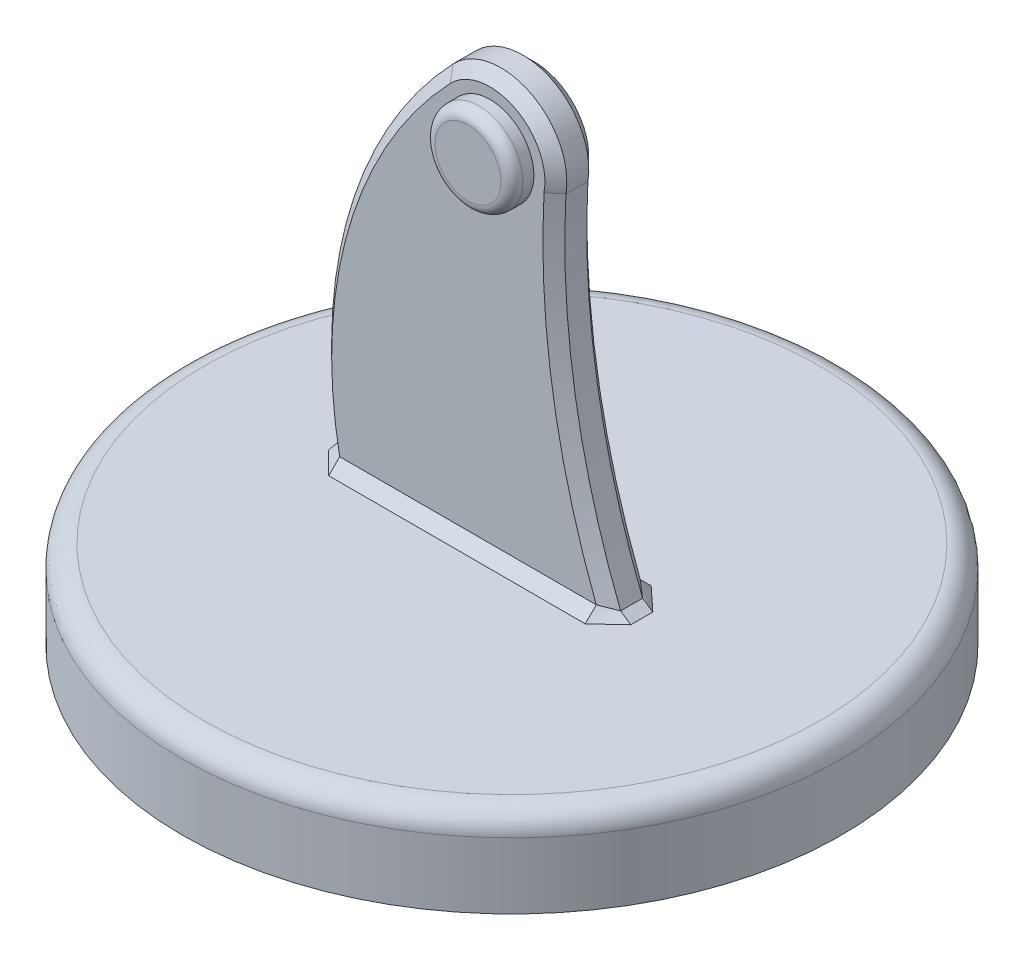
ISO-10303-21;
HEADER;
FILE_DESCRIPTION(('STEP AP214'),'2;1');
FILE_NAME('part.step','',(''),(''),'','','');
FILE_SCHEMA(('AUTOMOTIVE_DESIGN { 1 0 10303 214 1 1 1 1 }'));
ENDSEC;
DATA;
#1=APPLICATION_CONTEXT('core data for automotive mechanical design processes');
#2=APPLICATION_PROTOCOL_DEFINITION('international standard','automotive_design',2000,#1);
#3=PRODUCT_CONTEXT('',#1,'mechanical');
#4=PRODUCT('Part','Part','',(#3));
#5=PRODUCT_RELATED_PRODUCT_CATEGORY('part','',(#4));
#6=PRODUCT_DEFINITION_FORMATION('','',#4);
#7=PRODUCT_DEFINITION_CONTEXT('part definition',#1,'design');
#8=PRODUCT_DEFINITION('design','',#6,#7);
#9=PRODUCT_DEFINITION_SHAPE('','',#8);
#10=(LENGTH_UNIT() NAMED_UNIT(*) SI_UNIT(.MILLI.,.METRE.));
#11=(NAMED_UNIT(*) PLANE_ANGLE_UNIT() SI_UNIT($,.RADIAN.));
#12=(NAMED_UNIT(*) SI_UNIT($,.STERADIAN.) SOLID_ANGLE_UNIT());
#13=UNCERTAINTY_MEASURE_WITH_UNIT(LENGTH_MEASURE(1.E-05),#10,'distance_accuracy_value','');
#14=(GEOMETRIC_REPRESENTATION_CONTEXT(3) GLOBAL_UNCERTAINTY_ASSIGNED_CONTEXT((#13)) GLOBAL_UNIT_ASSIGNED_CONTEXT((#10,
#11,#12)) REPRESENTATION_CONTEXT('',''));
#15=CARTESIAN_POINT('',(0.,0.,0.));
#16=DIRECTION('',(0.,0.,1.));
#17=DIRECTION('',(1.,0.,0.));
#18=AXIS2_PLACEMENT_3D('',#15,#16,#17);
#19=CARTESIAN_POINT('',(0.,20.,0.));
#20=DIRECTION('',(0.,-1.,0.));
#21=DIRECTION('',(0.,0.,-1.));
#22=AXIS2_PLACEMENT_3D('',#19,#20,#21);
#23=CYLINDRICAL_SURFACE('',#22,75.);
#24=CARTESIAN_POINT('',(0.,15.,0.));
#25=DIRECTION('',(0.,1.,0.));
#26=DIRECTION('',(0.,0.,1.));
#27=AXIS2_PLACEMENT_3D('',#24,#25,#26);
#28=CIRCLE('',#27,75.);
#29=CARTESIAN_POINT('',(0.,15.,75.));
#30=VERTEX_POINT('',#29);
#31=EDGE_CURVE('E147',#30,#30,#28,.F.);
#32=ORIENTED_EDGE('',*,*,#31,.T.);
#33=EDGE_LOOP('',(#32));
#34=FACE_BOUND('',#33,.T.);
#35=CARTESIAN_POINT('',(0.,0.,0.));
#36=DIRECTION('',(0.,1.,0.));
#37=DIRECTION('',(0.,0.,1.));
#38=AXIS2_PLACEMENT_3D('',#35,#36,#37);
#39=CIRCLE('',#38,75.);
#40=CARTESIAN_POINT('',(0.,0.,75.));
#41=VERTEX_POINT('',#40);
#42=EDGE_CURVE('E432',#41,#41,#39,.T.);
#43=ORIENTED_EDGE('',*,*,#42,.T.);
#44=EDGE_LOOP('',(#43));
#45=FACE_BOUND('',#44,.T.);
#46=ADVANCED_FACE('F46',(#34,#45),#23,.T.);
#47=CARTESIAN_POINT('',(0.,20.,0.));
#48=DIRECTION('',(0.,1.,0.));
#49=DIRECTION('',(0.,0.,1.));
#50=AXIS2_PLACEMENT_3D('',#47,#48,#49);
#51=PLANE('',#50);
#52=DIRECTION('',(0.,0.,1.));
#53=VECTOR('',#52,1.);
#54=CARTESIAN_POINT('',(29.5605188092957,20.,0.));
#55=LINE('',#54,#53);
#56=CARTESIAN_POINT('',(29.5605188092957,20.,-2.49999999999997));
#57=VERTEX_POINT('',#56);
#58=CARTESIAN_POINT('',(29.5605188092957,20.,2.50000000000005));
#59=VERTEX_POINT('',#58);
#60=EDGE_CURVE('E487',#57,#59,#55,.T.);
#61=ORIENTED_EDGE('',*,*,#60,.T.);
#62=CARTESIAN_POINT('',(24.1925625260793,20.,7.49999999999995));
#63=CARTESIAN_POINT('',(25.0872219066154,20.,6.66666666666663));
#64=CARTESIAN_POINT('',(25.9818812871514,20.,5.83333333333332));
#65=CARTESIAN_POINT('',(27.7712000482236,20.,4.16666666666668));
#66=CARTESIAN_POINT('',(28.6658594287597,20.,3.33333333333337));
#67=CARTESIAN_POINT('',(29.5605188092957,20.,2.50000000000005));
#68=B_SPLINE_CURVE_WITH_KNOTS('',3,(#62,#63,#64,#65,#66,#67),.UNSPECIFIED.,.F.,.F.,(4,2,4),(0.,
3.66793384136498,7.33586768272996),.UNSPECIFIED.);
#69=CARTESIAN_POINT('',(24.1925625260793,20.,7.49999999999995));
#70=VERTEX_POINT('',#69);
#71=EDGE_CURVE('E228',#59,#70,#68,.F.);
#72=ORIENTED_EDGE('',*,*,#71,.T.);
#73=DIRECTION('',(-1.,0.,0.));
#74=VECTOR('',#73,1.);
#75=CARTESIAN_POINT('',(-36.2257918410724,20.,7.49999999999995));
#76=LINE('',#75,#74);
#77=CARTESIAN_POINT('',(-34.1909523693283,20.,7.49999999999995));
#78=VERTEX_POINT('',#77);
#79=EDGE_CURVE('E142',#70,#78,#76,.T.);
#80=ORIENTED_EDGE('',*,*,#79,.T.);
#81=CARTESIAN_POINT('',(-39.2818145076383,20.,2.50000000000005));
#82=CARTESIAN_POINT('',(-38.8244759997525,20.,2.94917589149019));
#83=CARTESIAN_POINT('',(-38.3671374918667,20.,3.39835178298034));
#84=CARTESIAN_POINT('',(-37.4524604760952,20.,4.29670356596062));
#85=CARTESIAN_POINT('',(-36.9951219682094,20.,4.74587945745076));
#86=CARTESIAN_POINT('',(-35.7555064299919,20.,5.96337023262725));
#87=CARTESIAN_POINT('',(-34.9732293996601,20.,6.7316851163136));
#88=CARTESIAN_POINT('',(-34.1909523693283,20.,7.49999999999995));
#89=B_SPLINE_CURVE_WITH_KNOTS('',3,(#81,#82,#83,#84,#85,#86,#87,#88),.UNSPECIFIED.,.F.,.F.,(4,2,
2,4),(0.,1.92308539348108,3.84617078696217,7.13560630299044),.UNSPECIFIED.);
#90=CARTESIAN_POINT('',(-39.2818145076383,20.,2.50000000000005));
#91=VERTEX_POINT('',#90);
#92=EDGE_CURVE('E134',#91,#78,#89,.T.);
#93=ORIENTED_EDGE('',*,*,#92,.F.);
#94=DIRECTION('',(0.,0.,-1.));
#95=VECTOR('',#94,1.);
#96=CARTESIAN_POINT('',(-39.2818145076383,20.,0.));
#97=LINE('',#96,#95);
#98=CARTESIAN_POINT('',(-39.2818145076383,20.,-2.49999999999997));
#99=VERTEX_POINT('',#98);
#100=EDGE_CURVE('E139',#91,#99,#97,.T.);
#101=ORIENTED_EDGE('',*,*,#100,.T.);
#102=CARTESIAN_POINT('',(-34.1909523693283,20.,-7.49999999999995));
#103=CARTESIAN_POINT('',(-34.648290877214,20.,-7.0508241085098));
#104=CARTESIAN_POINT('',(-35.1056293850998,20.,-6.60164821701966));
#105=CARTESIAN_POINT('',(-36.0203064008713,20.,-5.70329643403938));
#106=CARTESIAN_POINT('',(-36.4776449087571,20.,-5.25412054254923));
#107=CARTESIAN_POINT('',(-37.7172604469747,20.,-4.03662976737272));
#108=CARTESIAN_POINT('',(-38.4995374773065,20.,-3.26831488368635));
#109=CARTESIAN_POINT('',(-39.2818145076383,20.,-2.49999999999997));
#110=B_SPLINE_CURVE_WITH_KNOTS('',3,(#102,#103,#104,#105,#106,#107,#108,#109),.UNSPECIFIED.,.F.,
.F.,(4,2,2,4),(0.,1.92308539348108,3.84617078696216,7.13560630299053),.UNSPECIFIED.);
#111=CARTESIAN_POINT('',(-34.1909523693283,20.,-7.49999999999995));
#112=VERTEX_POINT('',#111);
#113=EDGE_CURVE('E166',#112,#99,#110,.T.);
#114=ORIENTED_EDGE('',*,*,#113,.F.);
#115=DIRECTION('',(1.,0.,0.));
#116=VECTOR('',#115,1.);
#117=CARTESIAN_POINT('',(0.,20.,-7.49999999999995));
#118=LINE('',#117,#116);
#119=CARTESIAN_POINT('',(24.1925625260792,20.,-7.49999999999995));
#120=VERTEX_POINT('',#119);
#121=EDGE_CURVE('E170',#112,#120,#118,.T.);
#122=ORIENTED_EDGE('',*,*,#121,.T.);
#123=CARTESIAN_POINT('',(29.5605188092957,20.,-2.49999999999997));
#124=CARTESIAN_POINT('',(28.6658594287596,20.,-3.3333333333333));
#125=CARTESIAN_POINT('',(27.7712000482235,20.,-4.16666666666663));
#126=CARTESIAN_POINT('',(25.9818812871514,20.,-5.83333333333329));
#127=CARTESIAN_POINT('',(25.0872219066153,20.,-6.66666666666662));
#128=CARTESIAN_POINT('',(24.1925625260792,20.,-7.49999999999995));
#129=B_SPLINE_CURVE_WITH_KNOTS('',3,(#123,#124,#125,#126,#127,#128),.UNSPECIFIED.,.F.,.F.,(4,2,
4),(0.,3.66793384136505,7.33586768273009),.UNSPECIFIED.);
#130=EDGE_CURVE('E220',#120,#57,#129,.F.);
#131=ORIENTED_EDGE('',*,*,#130,.T.);
#132=EDGE_LOOP('',(#61,#72,#80,#93,#101,#114,#122,#131));
#133=FACE_BOUND('',#132,.T.);
#134=CARTESIAN_POINT('',(0.,20.,0.));
#135=DIRECTION('',(0.,1.,0.));
#136=DIRECTION('',(0.,0.,1.));
#137=AXIS2_PLACEMENT_3D('',#134,#135,#136);
#138=CIRCLE('',#137,70.);
#139=CARTESIAN_POINT('',(0.,20.,70.));
#140=VERTEX_POINT('',#139);
#141=EDGE_CURVE('E430',#140,#140,#138,.T.);
#142=ORIENTED_EDGE('',*,*,#141,.T.);
#143=EDGE_LOOP('',(#142));
#144=FACE_BOUND('',#143,.T.);
#145=ADVANCED_FACE('F136',(#133,#144),#51,.T.);
#146=CARTESIAN_POINT('',(0.,0.,0.));
#147=DIRECTION('',(0.,1.,0.));
#148=DIRECTION('',(0.,0.,1.));
#149=AXIS2_PLACEMENT_3D('',#146,#147,#148);
#150=PLANE('',#149);
#151=ORIENTED_EDGE('',*,*,#42,.F.);
#152=EDGE_LOOP('',(#151));
#153=FACE_BOUND('',#152,.T.);
#154=ADVANCED_FACE('F412',(#153),#150,.F.);
#155=CARTESIAN_POINT('',(0.,15.,0.));
#156=DIRECTION('',(0.,1.,0.));
#157=DIRECTION('',(0.,0.,1.));
#158=AXIS2_PLACEMENT_3D('',#155,#156,#157);
#159=TOROIDAL_SURFACE('',#158,70.,5.);
#160=ORIENTED_EDGE('',*,*,#31,.F.);
#161=EDGE_LOOP('',(#160));
#162=FACE_BOUND('',#161,.T.);
#163=ORIENTED_EDGE('',*,*,#141,.F.);
#164=EDGE_LOOP('',(#163));
#165=FACE_BOUND('',#164,.T.);
#166=ADVANCED_FACE('F415',(#162,#165),#159,.T.);
#167=CARTESIAN_POINT('',(194.538114740849,87.9877304588052,5.));
#168=DIRECTION('',(0.,0.,-1.));
#169=DIRECTION('',(-1.,0.,0.));
#170=AXIS2_PLACEMENT_3D('',#167,#168,#169);
#171=CYLINDRICAL_SURFACE('',#170,180.);
#172=DIRECTION('',(0.,0.,-1.));
#173=VECTOR('',#172,1.);
#174=CARTESIAN_POINT('',(14.7893751360172,97.4951281297934,5.));
#175=LINE('',#174,#173);
#176=CARTESIAN_POINT('',(14.7893751360172,97.4951281297934,2.50000000000005));
#177=VERTEX_POINT('',#176);
#178=CARTESIAN_POINT('',(14.7893751360172,97.4951281297934,-2.49999999999997));
#179=VERTEX_POINT('',#178);
#180=EDGE_CURVE('E438',#177,#179,#175,.T.);
#181=ORIENTED_EDGE('',*,*,#180,.F.);
#182=CARTESIAN_POINT('',(194.538114740849,87.9877304588052,2.50000000000005));
#183=DIRECTION('',(0.,0.,1.));
#184=DIRECTION('',(1.,0.,0.));
#185=AXIS2_PLACEMENT_3D('',#182,#183,#184);
#186=CIRCLE('',#185,180.);
#187=CARTESIAN_POINT('',(27.2368906975837,21.5776375991717,2.50000000000005));
#188=VERTEX_POINT('',#187);
#189=EDGE_CURVE('E517',#177,#188,#186,.T.);
#190=ORIENTED_EDGE('',*,*,#189,.T.);
#191=DIRECTION('',(0.,0.,-1.));
#192=VECTOR('',#191,1.);
#193=CARTESIAN_POINT('',(27.2368906975837,21.5776375991717,5.));
#194=LINE('',#193,#192);
#195=CARTESIAN_POINT('',(27.2368906975837,21.5776375991717,-2.49999999999997));
#196=VERTEX_POINT('',#195);
#197=EDGE_CURVE('E514',#188,#196,#194,.T.);
#198=ORIENTED_EDGE('',*,*,#197,.T.);
#199=CARTESIAN_POINT('',(194.538114740849,87.9877304588052,-2.49999999999997));
#200=DIRECTION('',(0.,0.,1.));
#201=DIRECTION('',(1.,0.,0.));
#202=AXIS2_PLACEMENT_3D('',#199,#200,#201);
#203=CIRCLE('',#202,180.);
#204=EDGE_CURVE('E490',#196,#179,#203,.F.);
#205=ORIENTED_EDGE('',*,*,#204,.T.);
#206=EDGE_LOOP('',(#181,#190,#198,#205));
#207=FACE_BOUND('',#206,.T.);
#208=ADVANCED_FACE('F417',(#207),#171,.F.);
#209=CARTESIAN_POINT('',(0.,100.,5.));
#210=DIRECTION('',(0.,0.,-1.));
#211=DIRECTION('',(-1.,0.,0.));
#212=AXIS2_PLACEMENT_3D('',#209,#210,#211);
#213=CYLINDRICAL_SURFACE('',#212,14.9999999999999);
#214=DIRECTION('',(0.,0.,-1.));
#215=VECTOR('',#214,1.);
#216=CARTESIAN_POINT('',(-10.8492014290604,110.358321695703,5.));
#217=LINE('',#216,#215);
#218=CARTESIAN_POINT('',(-10.8492014290604,110.358321695703,2.50000000000005));
#219=VERTEX_POINT('',#218);
#220=CARTESIAN_POINT('',(-10.8492014290604,110.358321695703,-2.49999999999997));
#221=VERTEX_POINT('',#220);
#222=EDGE_CURVE('E448',#219,#221,#217,.T.);
#223=ORIENTED_EDGE('',*,*,#222,.F.);
#224=CARTESIAN_POINT('',(0.,100.,2.50000000000005));
#225=DIRECTION('',(0.,0.,1.));
#226=DIRECTION('',(1.,0.,0.));
#227=AXIS2_PLACEMENT_3D('',#224,#225,#226);
#228=CIRCLE('',#227,14.9999999999999);
#229=EDGE_CURVE('E229',#219,#177,#228,.F.);
#230=ORIENTED_EDGE('',*,*,#229,.T.);
#231=ORIENTED_EDGE('',*,*,#180,.T.);
#232=CARTESIAN_POINT('',(0.,100.,-2.49999999999997));
#233=DIRECTION('',(0.,0.,1.));
#234=DIRECTION('',(1.,0.,0.));
#235=AXIS2_PLACEMENT_3D('',#232,#233,#234);
#236=CIRCLE('',#235,14.9999999999999);
#237=EDGE_CURVE('E538',#179,#221,#236,.T.);
#238=ORIENTED_EDGE('',*,*,#237,.T.);
#239=EDGE_LOOP('',(#223,#230,#231,#238));
#240=FACE_BOUND('',#239,.T.);
#241=ADVANCED_FACE('F423',(#240),#213,.T.);
#242=CARTESIAN_POINT('',(61.4788080980091,41.3028437243492,5.));
#243=DIRECTION('',(0.,0.,-1.));
#244=DIRECTION('',(-1.,0.,0.));
#245=AXIS2_PLACEMENT_3D('',#242,#243,#244);
#246=CYLINDRICAL_SURFACE('',#245,100.);
#247=DIRECTION('',(0.,0.,-1.));
#248=VECTOR('',#247,1.);
#249=CARTESIAN_POINT('',(-36.824238346525,22.9586059444963,5.));
#250=LINE('',#249,#248);
#251=CARTESIAN_POINT('',(-36.824238346525,22.9586059444963,-2.49999999999997));
#252=VERTEX_POINT('',#251);
#253=CARTESIAN_POINT('',(-36.824238346525,22.9586059444963,2.50000000000005));
#254=VERTEX_POINT('',#253);
#255=EDGE_CURVE('E523',#252,#254,#250,.F.);
#256=ORIENTED_EDGE('',*,*,#255,.T.);
#257=CARTESIAN_POINT('',(61.4788080980091,41.3028437243492,2.50000000000005));
#258=DIRECTION('',(0.,0.,1.));
#259=DIRECTION('',(1.,0.,0.));
#260=AXIS2_PLACEMENT_3D('',#257,#258,#259);
#261=CIRCLE('',#260,100.);
#262=EDGE_CURVE('E526',#254,#219,#261,.F.);
#263=ORIENTED_EDGE('',*,*,#262,.T.);
#264=ORIENTED_EDGE('',*,*,#222,.T.);
#265=CARTESIAN_POINT('',(61.4788080980091,41.3028437243492,-2.49999999999997));
#266=DIRECTION('',(0.,0.,1.));
#267=DIRECTION('',(1.,0.,0.));
#268=AXIS2_PLACEMENT_3D('',#265,#266,#267);
#269=CIRCLE('',#268,100.);
#270=EDGE_CURVE('E520',#221,#252,#269,.T.);
#271=ORIENTED_EDGE('',*,*,#270,.T.);
#272=EDGE_LOOP('',(#256,#263,#264,#271));
#273=FACE_BOUND('',#272,.T.);
#274=ADVANCED_FACE('F570',(#273),#246,.T.);
#275=CARTESIAN_POINT('',(194.538114740849,87.9877304588052,5.));
#276=DIRECTION('',(0.,0.,1.));
#277=DIRECTION('',(1.,0.,0.));
#278=AXIS2_PLACEMENT_3D('',#275,#276,#277);
#279=PLANE('',#278);
#280=CARTESIAN_POINT('',(0.,100.,5.));
#281=DIRECTION('',(0.,0.,1.));
#282=DIRECTION('',(1.,0.,0.));
#283=AXIS2_PLACEMENT_3D('',#280,#281,#282);
#284=CIRCLE('',#283,10.);
#285=CARTESIAN_POINT('',(10.,100.,5.));
#286=VERTEX_POINT('',#285);
#287=EDGE_CURVE('E241',#286,#286,#284,.T.);
#288=ORIENTED_EDGE('',*,*,#287,.F.);
#289=EDGE_LOOP('',(#288));
#290=FACE_BOUND('',#289,.T.);
#291=CARTESIAN_POINT('',(194.538114740849,87.9877304588052,5.));
#292=DIRECTION('',(0.,0.,1.));
#293=DIRECTION('',(1.,0.,0.));
#294=AXIS2_PLACEMENT_3D('',#291,#292,#293);
#295=CIRCLE('',#294,182.5);
#296=CARTESIAN_POINT('',(24.1925625260793,22.5,5.));
#297=VERTEX_POINT('',#296);
#298=CARTESIAN_POINT('',(12.3008971882817,97.7778550084835,5.));
#299=VERTEX_POINT('',#298);
#300=EDGE_CURVE('E62',#297,#299,#295,.F.);
#301=ORIENTED_EDGE('',*,*,#300,.T.);
#302=CARTESIAN_POINT('',(0.,100.,5.));
#303=DIRECTION('',(0.,0.,1.));
#304=DIRECTION('',(1.,0.,0.));
#305=AXIS2_PLACEMENT_3D('',#302,#303,#304);
#306=CIRCLE('',#305,12.4999999999999);
#307=CARTESIAN_POINT('',(-9.04100119088374,108.631934746419,5.));
#308=VERTEX_POINT('',#307);
#309=EDGE_CURVE('E536',#299,#308,#306,.T.);
#310=ORIENTED_EDGE('',*,*,#309,.T.);
#311=CARTESIAN_POINT('',(61.4788080980091,41.3028437243492,5.));
#312=DIRECTION('',(0.,0.,1.));
#313=DIRECTION('',(1.,0.,0.));
#314=AXIS2_PLACEMENT_3D('',#311,#312,#313);
#315=CIRCLE('',#314,97.5000000000001);
#316=CARTESIAN_POINT('',(-34.1909523693283,22.5,5.));
#317=VERTEX_POINT('',#316);
#318=EDGE_CURVE('E529',#308,#317,#315,.T.);
#319=ORIENTED_EDGE('',*,*,#318,.T.);
#320=DIRECTION('',(1.,0.,0.));
#321=VECTOR('',#320,1.);
#322=CARTESIAN_POINT('',(27.8717758866555,22.5,5.));
#323=LINE('',#322,#321);
#324=EDGE_CURVE('E67',#317,#297,#323,.T.);
#325=ORIENTED_EDGE('',*,*,#324,.T.);
#326=EDGE_LOOP('',(#301,#310,#319,#325));
#327=FACE_BOUND('',#326,.T.);
#328=ADVANCED_FACE('F474',(#290,#327),#279,.T.);
#329=CARTESIAN_POINT('',(194.538114740849,87.9877304588052,-5.));
#330=DIRECTION('',(0.,0.,1.));
#331=DIRECTION('',(1.,0.,0.));
#332=AXIS2_PLACEMENT_3D('',#329,#330,#331);
#333=PLANE('',#332);
#334=CARTESIAN_POINT('',(0.,100.,-5.));
#335=DIRECTION('',(0.,0.,-1.));
#336=DIRECTION('',(-1.,0.,0.));
#337=AXIS2_PLACEMENT_3D('',#334,#335,#336);
#338=CIRCLE('',#337,5.);
#339=CARTESIAN_POINT('',(-5.,100.,-5.));
#340=VERTEX_POINT('',#339);
#341=EDGE_CURVE('E456',#340,#340,#338,.T.);
#342=ORIENTED_EDGE('',*,*,#341,.F.);
#343=EDGE_LOOP('',(#342));
#344=FACE_BOUND('',#343,.T.);
#345=CARTESIAN_POINT('',(194.538114740849,87.9877304588052,-5.));
#346=DIRECTION('',(0.,0.,1.));
#347=DIRECTION('',(1.,0.,0.));
#348=AXIS2_PLACEMENT_3D('',#345,#346,#347);
#349=CIRCLE('',#348,182.5);
#350=CARTESIAN_POINT('',(12.3008971882816,97.7778550084834,-5.));
#351=VERTEX_POINT('',#350);
#352=CARTESIAN_POINT('',(24.1925625260792,22.5,-5.));
#353=VERTEX_POINT('',#352);
#354=EDGE_CURVE('E478',#351,#353,#349,.T.);
#355=ORIENTED_EDGE('',*,*,#354,.T.);
#356=DIRECTION('',(-1.,0.,0.));
#357=VECTOR('',#356,1.);
#358=CARTESIAN_POINT('',(194.538114740849,22.5,-5.));
#359=LINE('',#358,#357);
#360=CARTESIAN_POINT('',(-34.1909523693283,22.5,-5.));
#361=VERTEX_POINT('',#360);
#362=EDGE_CURVE('E481',#353,#361,#359,.T.);
#363=ORIENTED_EDGE('',*,*,#362,.T.);
#364=CARTESIAN_POINT('',(61.4788080980091,41.3028437243492,-5.));
#365=DIRECTION('',(0.,0.,1.));
#366=DIRECTION('',(1.,0.,0.));
#367=AXIS2_PLACEMENT_3D('',#364,#365,#366);
#368=CIRCLE('',#367,97.5);
#369=CARTESIAN_POINT('',(-9.04100119088359,108.631934746419,-5.));
#370=VERTEX_POINT('',#369);
#371=EDGE_CURVE('E500',#361,#370,#368,.F.);
#372=ORIENTED_EDGE('',*,*,#371,.T.);
#373=CARTESIAN_POINT('',(0.,100.,-5.));
#374=DIRECTION('',(0.,0.,1.));
#375=DIRECTION('',(1.,0.,0.));
#376=AXIS2_PLACEMENT_3D('',#373,#374,#375);
#377=CIRCLE('',#376,12.4999999999998);
#378=EDGE_CURVE('E483',#370,#351,#377,.F.);
#379=ORIENTED_EDGE('',*,*,#378,.T.);
#380=EDGE_LOOP('',(#355,#363,#372,#379));
#381=FACE_BOUND('',#380,.T.);
#382=ADVANCED_FACE('F393',(#344,#381),#333,.F.);
#383=CARTESIAN_POINT('',(0.,100.,5.));
#384=DIRECTION('',(0.,0.,-1.));
#385=DIRECTION('',(-1.,0.,0.));
#386=AXIS2_PLACEMENT_3D('',#383,#384,#385);
#387=CONICAL_SURFACE('',#386,12.4999999999999,0.785398163397448);
#388=CARTESIAN_POINT('',(14.7893751360172,97.4951281297934,2.50000000000005));
#389=CARTESIAN_POINT('',(14.3745218138183,97.5410281310301,2.91669818657102));
#390=CARTESIAN_POINT('',(13.9597220092518,97.5875387026756,3.33338059425491));
#391=CARTESIAN_POINT('',(13.1302293599871,97.6817809953503,4.16671392759397));
#392=CARTESIAN_POINT('',(12.7155365153085,97.7295127166016,4.5833648532434));
#393=CARTESIAN_POINT('',(12.3008971882817,97.7778550084837,5.00000000000001));
#394=B_SPLINE_CURVE_WITH_KNOTS('',3,(#388,#389,#390,#391,#392,#393),.UNSPECIFIED.,.F.,.F.,(4,2,
4),(0.,1.76935498420985,3.53871029006904),.UNSPECIFIED.);
#395=EDGE_CURVE('E365',#177,#299,#394,.T.);
#396=ORIENTED_EDGE('',*,*,#395,.F.);
#397=ORIENTED_EDGE('',*,*,#229,.F.);
#398=DIRECTION('',(-0.511436260063163,0.488295967516223,-0.707106781186548));
#399=VECTOR('',#398,1.);
#400=CARTESIAN_POINT('',(-9.04100119088365,108.631934746419,5.));
#401=LINE('',#400,#399);
#402=EDGE_CURVE('E375',#308,#219,#401,.T.);
#403=ORIENTED_EDGE('',*,*,#402,.F.);
#404=ORIENTED_EDGE('',*,*,#309,.F.);
#405=EDGE_LOOP('',(#396,#397,#403,#404));
#406=FACE_BOUND('',#405,.T.);
#407=ADVANCED_FACE('F384',(#406),#387,.T.);
#408=CARTESIAN_POINT('',(61.4788080980091,41.3028437243492,5.));
#409=DIRECTION('',(0.,0.,-1.));
#410=DIRECTION('',(-1.,0.,0.));
#411=AXIS2_PLACEMENT_3D('',#408,#409,#410);
#412=CONICAL_SURFACE('',#411,97.5000000000001,0.785398163397448);
#413=ORIENTED_EDGE('',*,*,#402,.T.);
#414=ORIENTED_EDGE('',*,*,#262,.F.);
#415=CARTESIAN_POINT('',(-34.1909523693283,22.5,5.));
#416=CARTESIAN_POINT('',(-34.4217601423367,22.5398596157803,4.78121161748755));
#417=CARTESIAN_POINT('',(-34.6525155154099,22.5797693808432,4.56237705149883));
#418=CARTESIAN_POINT('',(-35.1139229558263,22.6597356997571,4.12462584399775));
#419=CARTESIAN_POINT('',(-35.3445750231681,22.6997922536101,3.9057092024843));
#420=CARTESIAN_POINT('',(-35.9916948606037,22.8124713389536,3.29127809131214));
#421=CARTESIAN_POINT('',(-36.4080474511341,22.8853125128457,2.89568242368915));
#422=CARTESIAN_POINT('',(-36.824238346525,22.9586059444963,2.50000000000005));
#423=B_SPLINE_CURVE_WITH_KNOTS('',3,(#415,#416,#417,#418,#419,#420,#421,#422),.UNSPECIFIED.,.F.,
.F.,(4,2,2,4),(0.,0.961542734405387,1.92308548157722,3.6598526229235),.UNSPECIFIED.);
#424=EDGE_CURVE('E154',#317,#254,#423,.T.);
#425=ORIENTED_EDGE('',*,*,#424,.F.);
#426=ORIENTED_EDGE('',*,*,#318,.F.);
#427=EDGE_LOOP('',(#413,#414,#425,#426));
#428=FACE_BOUND('',#427,.T.);
#429=ADVANCED_FACE('F392',(#428),#412,.T.);
#430=CARTESIAN_POINT('',(194.538114740849,22.5,5.));
#431=DIRECTION('',(0.,0.707106781186547,0.707106781186548));
#432=DIRECTION('',(-1.,0.,0.));
#433=AXIS2_PLACEMENT_3D('',#430,#431,#432);
#434=PLANE('',#433);
#435=DIRECTION('',(0.,-0.707106781186548,0.707106781186547));
#436=VECTOR('',#435,1.);
#437=CARTESIAN_POINT('',(24.1925625260793,22.5,5.));
#438=LINE('',#437,#436);
#439=EDGE_CURVE('E556',#297,#70,#438,.T.);
#440=ORIENTED_EDGE('',*,*,#439,.F.);
#441=ORIENTED_EDGE('',*,*,#324,.F.);
#442=DIRECTION('',(0.,0.707106781186548,-0.707106781186547));
#443=VECTOR('',#442,1.);
#444=CARTESIAN_POINT('',(-34.1909523693283,20.,7.49999999999995));
#445=LINE('',#444,#443);
#446=EDGE_CURVE('E575',#78,#317,#445,.T.);
#447=ORIENTED_EDGE('',*,*,#446,.F.);
#448=ORIENTED_EDGE('',*,*,#79,.F.);
#449=EDGE_LOOP('',(#440,#441,#447,#448));
#450=FACE_BOUND('',#449,.T.);
#451=ADVANCED_FACE('F349',(#450),#434,.T.);
#452=CARTESIAN_POINT('',(194.538114740849,87.9877304588052,5.));
#453=DIRECTION('',(0.,0.,1.));
#454=DIRECTION('',(1.,0.,0.));
#455=AXIS2_PLACEMENT_3D('',#452,#453,#454);
#456=CONICAL_SURFACE('',#455,182.5,0.785398163397443);
#457=ORIENTED_EDGE('',*,*,#395,.T.);
#458=ORIENTED_EDGE('',*,*,#300,.F.);
#459=CARTESIAN_POINT('',(27.2368906975837,21.5776375991717,2.50000000000005));
#460=CARTESIAN_POINT('',(26.8974090346798,21.6811610095516,2.77733465864687));
#461=CARTESIAN_POINT('',(26.5581180254741,21.784797959554,3.05486366706941));
#462=CARTESIAN_POINT('',(25.8809097308666,21.9912059595025,3.6097627673711));
#463=CARTESIAN_POINT('',(25.5429913484102,22.0939786630628,3.88713090639249));
#464=CARTESIAN_POINT('',(24.867510981128,22.2981873595592,4.44279938137728));
#465=CARTESIAN_POINT('',(24.5299490005149,22.3996233368536,4.72109972820121));
#466=CARTESIAN_POINT('',(24.1925625260793,22.5,5.));
#467=B_SPLINE_CURVE_WITH_KNOTS('',3,(#459,#460,#461,#462,#463,#464,#465,#466),.UNSPECIFIED.,.F.,
.F.,(4,2,2,4),(0.,1.35126778666986,2.69854342924171,4.04583482298297),.UNSPECIFIED.);
#468=EDGE_CURVE('E357',#188,#297,#467,.T.);
#469=ORIENTED_EDGE('',*,*,#468,.F.);
#470=ORIENTED_EDGE('',*,*,#189,.F.);
#471=EDGE_LOOP('',(#457,#458,#469,#470));
#472=FACE_BOUND('',#471,.T.);
#473=ADVANCED_FACE('F342',(#472),#456,.F.);
#474=CARTESIAN_POINT('',(-34.1909523693283,22.5,5.));
#475=CARTESIAN_POINT('',(-36.824238346525,22.9586059444963,2.50000000000005));
#476=CARTESIAN_POINT('',(-34.1909523693283,20.,7.49999999999995));
#477=CARTESIAN_POINT('',(-39.2818145076383,20.,2.50000000000005));
#478=B_SPLINE_SURFACE_WITH_KNOTS('',1,1,((#474,#475),(#476,#477)),.UNSPECIFIED.,.F.,.F.,.F.,(2,
2),(2,2),(0.,1.),(0.,1.),.UNSPECIFIED.);
#479=DIRECTION('',(-0.638966987488978,-0.769234157392442,0.));
#480=VECTOR('',#479,1.);
#481=CARTESIAN_POINT('',(-36.824238346525,22.9586059444963,2.50000000000005));
#482=LINE('',#481,#480);
#483=EDGE_CURVE('E151',#91,#254,#482,.F.);
#484=ORIENTED_EDGE('',*,*,#446,.T.);
#485=ORIENTED_EDGE('',*,*,#424,.T.);
#486=ORIENTED_EDGE('',*,*,#483,.F.);
#487=ORIENTED_EDGE('',*,*,#92,.T.);
#488=EDGE_LOOP('',(#484,#485,#486,#487));
#489=FACE_BOUND('',#488,.T.);
#490=ADVANCED_FACE('F152',(#489),#478,.F.);
#491=CARTESIAN_POINT('',(27.2136544164666,21.5934139751635,2.50000000000005));
#492=CARTESIAN_POINT('',(24.1925625260793,22.525,4.975));
#493=CARTESIAN_POINT('',(27.2368906975837,21.5776375991717,2.50000000000005));
#494=CARTESIAN_POINT('',(24.1925625260793,22.5,5.));
#495=CARTESIAN_POINT('',(29.5605188092957,20.,2.50000000000005));
#496=CARTESIAN_POINT('',(24.1925625260793,20.,7.49999999999995));
#497=B_SPLINE_SURFACE_WITH_KNOTS('',1,1,((#491,#492),(#493,#494),(#495,#496)),.UNSPECIFIED.,.F.,
.F.,.F.,(2,1,2),(2,2),(-0.01,0.,1.),(0.,1.),.UNSPECIFIED.);
#498=DIRECTION('',(-0.827328520096855,0.561718363447687,0.));
#499=VECTOR('',#498,1.);
#500=CARTESIAN_POINT('',(29.5605188092957,20.,2.50000000000005));
#501=LINE('',#500,#499);
#502=EDGE_CURVE('E159',#188,#59,#501,.F.);
#503=ORIENTED_EDGE('',*,*,#439,.T.);
#504=ORIENTED_EDGE('',*,*,#71,.F.);
#505=ORIENTED_EDGE('',*,*,#502,.F.);
#506=ORIENTED_EDGE('',*,*,#468,.T.);
#507=EDGE_LOOP('',(#503,#504,#505,#506));
#508=FACE_BOUND('',#507,.T.);
#509=ADVANCED_FACE('F326',(#508),#497,.F.);
#510=CARTESIAN_POINT('',(0.,100.,-2.49999999999997));
#511=DIRECTION('',(0.,0.,1.));
#512=DIRECTION('',(1.,0.,0.));
#513=AXIS2_PLACEMENT_3D('',#510,#511,#512);
#514=CONICAL_SURFACE('',#513,14.9999999999999,0.785398163397449);
#515=CARTESIAN_POINT('',(12.3008971882816,97.7778550084834,-5.));
#516=CARTESIAN_POINT('',(12.7155365153084,97.7295127166016,-4.58336485324339));
#517=CARTESIAN_POINT('',(13.1302293599871,97.6817809953505,-4.16671392759395));
#518=CARTESIAN_POINT('',(13.9597220092517,97.5875387026754,-3.33338059425486));
#519=CARTESIAN_POINT('',(14.3745218138182,97.5410281310295,-2.91669818657094));
#520=CARTESIAN_POINT('',(14.789375136017,97.4951281297922,-2.49999999999994));
#521=B_SPLINE_CURVE_WITH_KNOTS('',3,(#515,#516,#517,#518,#519,#520),.UNSPECIFIED.,.F.,.F.,(4,2,
4),(0.,1.76935530585926,3.53871029006917),.UNSPECIFIED.);
#522=EDGE_CURVE('E309',#351,#179,#521,.T.);
#523=ORIENTED_EDGE('',*,*,#522,.F.);
#524=ORIENTED_EDGE('',*,*,#378,.F.);
#525=DIRECTION('',(0.511436260063162,-0.488295967516226,-0.707106781186547));
#526=VECTOR('',#525,1.);
#527=CARTESIAN_POINT('',(-10.8492014290604,110.358321695703,-2.49999999999997));
#528=LINE('',#527,#526);
#529=EDGE_CURVE('E158',#221,#370,#528,.T.);
#530=ORIENTED_EDGE('',*,*,#529,.F.);
#531=ORIENTED_EDGE('',*,*,#237,.F.);
#532=EDGE_LOOP('',(#523,#524,#530,#531));
#533=FACE_BOUND('',#532,.T.);
#534=ADVANCED_FACE('F294',(#533),#514,.T.);
#535=CARTESIAN_POINT('',(61.4788080980091,41.3028437243492,-2.49999999999997));
#536=DIRECTION('',(0.,0.,1.));
#537=DIRECTION('',(1.,0.,0.));
#538=AXIS2_PLACEMENT_3D('',#535,#536,#537);
#539=CONICAL_SURFACE('',#538,100.,0.785398163397446);
#540=ORIENTED_EDGE('',*,*,#529,.T.);
#541=ORIENTED_EDGE('',*,*,#371,.F.);
#542=CARTESIAN_POINT('',(-36.824238346525,22.9586059444963,-2.49999999999997));
#543=CARTESIAN_POINT('',(-36.593818836663,22.9180280254912,-2.71906551869206));
#544=CARTESIAN_POINT('',(-36.3633496323438,22.8775885628052,-2.93810433544188));
#545=CARTESIAN_POINT('',(-35.9023104823569,22.7969402374474,-3.376118386445));
#546=CARTESIAN_POINT('',(-35.6717405366918,22.7567313747698,-3.59509362069989));
#547=CARTESIAN_POINT('',(-35.0245650400962,22.6441546433633,-4.2094849482845));
#548=CARTESIAN_POINT('',(-34.6078439843188,22.5719952443046,-4.60481761298728));
#549=CARTESIAN_POINT('',(-34.1909523693283,22.4999999999999,-5.00000000000001));
#550=B_SPLINE_CURVE_WITH_KNOTS('',3,(#542,#543,#544,#545,#546,#547,#548,#549),.UNSPECIFIED.,.F.,
.F.,(4,2,2,4),(0.,0.961542792130382,1.92308556027607,3.65985267305808),.UNSPECIFIED.);
#551=EDGE_CURVE('E301',#252,#361,#550,.T.);
#552=ORIENTED_EDGE('',*,*,#551,.F.);
#553=ORIENTED_EDGE('',*,*,#270,.F.);
#554=EDGE_LOOP('',(#540,#541,#552,#553));
#555=FACE_BOUND('',#554,.T.);
#556=ADVANCED_FACE('F282',(#555),#539,.T.);
#557=CARTESIAN_POINT('',(-39.2818145076383,20.,5.));
#558=DIRECTION('',(0.769234157392442,-0.638966987488978,0.));
#559=DIRECTION('',(0.,0.,-1.));
#560=AXIS2_PLACEMENT_3D('',#557,#558,#559);
#561=PLANE('',#560);
#562=ORIENTED_EDGE('',*,*,#483,.T.);
#563=ORIENTED_EDGE('',*,*,#255,.F.);
#564=DIRECTION('',(0.638966987488978,0.769234157392442,0.));
#565=VECTOR('',#564,1.);
#566=CARTESIAN_POINT('',(-39.2818145076383,20.,-2.49999999999997));
#567=LINE('',#566,#565);
#568=EDGE_CURVE('E163',#99,#252,#567,.T.);
#569=ORIENTED_EDGE('',*,*,#568,.F.);
#570=ORIENTED_EDGE('',*,*,#100,.F.);
#571=EDGE_LOOP('',(#562,#563,#569,#570));
#572=FACE_BOUND('',#571,.T.);
#573=ADVANCED_FACE('F161',(#572),#561,.F.);
#574=CARTESIAN_POINT('',(29.5605188092957,20.,5.));
#575=DIRECTION('',(0.561718363447685,0.827328520096857,0.));
#576=DIRECTION('',(0.,0.,-1.));
#577=AXIS2_PLACEMENT_3D('',#574,#575,#576);
#578=PLANE('',#577);
#579=ORIENTED_EDGE('',*,*,#502,.T.);
#580=ORIENTED_EDGE('',*,*,#60,.F.);
#581=DIRECTION('',(0.827328520096855,-0.561718363447687,0.));
#582=VECTOR('',#581,1.);
#583=CARTESIAN_POINT('',(27.2368906975837,21.5776375991717,-2.49999999999997));
#584=LINE('',#583,#582);
#585=EDGE_CURVE('E253',#196,#57,#584,.T.);
#586=ORIENTED_EDGE('',*,*,#585,.F.);
#587=ORIENTED_EDGE('',*,*,#197,.F.);
#588=EDGE_LOOP('',(#579,#580,#586,#587));
#589=FACE_BOUND('',#588,.T.);
#590=ADVANCED_FACE('F330',(#589),#578,.T.);
#591=CARTESIAN_POINT('',(194.538114740849,87.9877304588052,-2.49999999999997));
#592=DIRECTION('',(0.,0.,-1.));
#593=DIRECTION('',(-1.,0.,0.));
#594=AXIS2_PLACEMENT_3D('',#591,#592,#593);
#595=CONICAL_SURFACE('',#594,180.,0.785398163397448);
#596=ORIENTED_EDGE('',*,*,#522,.T.);
#597=ORIENTED_EDGE('',*,*,#204,.F.);
#598=CARTESIAN_POINT('',(24.1925625260792,22.5,-5.));
#599=CARTESIAN_POINT('',(24.6352464203144,22.3683013717533,-4.63405238770475));
#600=CARTESIAN_POINT('',(25.0782320650659,22.2347729281915,-4.26914181792358));
#601=CARTESIAN_POINT('',(25.8071598673272,22.0136576721703,-3.6703055856932));
#602=CARTESIAN_POINT('',(26.0929192290752,21.9266223819224,-3.43595433897503));
#603=CARTESIAN_POINT('',(26.6647041117096,21.7522429540279,-2.96768985828928));
#604=CARTESIAN_POINT('',(26.9507296333912,21.6648988154564,-2.73377662563657));
#605=CARTESIAN_POINT('',(27.2368906975837,21.5776375991717,-2.49999999999997));
#606=B_SPLINE_CURVE_WITH_KNOTS('',3,(#598,#599,#600,#601,#602,#603,#604,#605),.UNSPECIFIED.,.F.,
.F.,(4,2,2,4),(0.,1.76777518451839,2.90680286300766,4.04583395530957),.UNSPECIFIED.);
#607=EDGE_CURVE('E244',#353,#196,#606,.T.);
#608=ORIENTED_EDGE('',*,*,#607,.F.);
#609=ORIENTED_EDGE('',*,*,#354,.F.);
#610=EDGE_LOOP('',(#596,#597,#608,#609));
#611=FACE_BOUND('',#610,.T.);
#612=ADVANCED_FACE('F256',(#611),#595,.F.);
#613=CARTESIAN_POINT('',(-36.824238346525,22.9586059444963,-2.49999999999997));
#614=CARTESIAN_POINT('',(-34.1909523693283,22.5,-5.));
#615=CARTESIAN_POINT('',(-39.2818145076383,20.,-2.49999999999997));
#616=CARTESIAN_POINT('',(-34.1909523693283,20.,-7.49999999999995));
#617=B_SPLINE_SURFACE_WITH_KNOTS('',1,1,((#613,#614),(#615,#616)),.UNSPECIFIED.,.F.,.F.,.F.,(2,
2),(2,2),(0.,1.),(0.,1.),.UNSPECIFIED.);
#618=DIRECTION('',(0.,-0.707106781186548,-0.707106781186547));
#619=VECTOR('',#618,1.);
#620=CARTESIAN_POINT('',(-34.1909523693283,22.5,-5.));
#621=LINE('',#620,#619);
#622=EDGE_CURVE('E240',#112,#361,#621,.F.);
#623=ORIENTED_EDGE('',*,*,#568,.T.);
#624=ORIENTED_EDGE('',*,*,#551,.T.);
#625=ORIENTED_EDGE('',*,*,#622,.F.);
#626=ORIENTED_EDGE('',*,*,#113,.T.);
#627=EDGE_LOOP('',(#623,#624,#625,#626));
#628=FACE_BOUND('',#627,.T.);
#629=ADVANCED_FACE('F280',(#628),#617,.F.);
#630=CARTESIAN_POINT('',(24.1925625260792,22.525,-4.975));
#631=CARTESIAN_POINT('',(27.2136544164666,21.5934139751635,-2.49999999999997));
#632=CARTESIAN_POINT('',(24.1925625260792,22.5,-5.));
#633=CARTESIAN_POINT('',(27.2368906975837,21.5776375991717,-2.49999999999997));
#634=CARTESIAN_POINT('',(24.1925625260792,20.,-7.49999999999995));
#635=CARTESIAN_POINT('',(29.5605188092957,20.,-2.49999999999997));
#636=B_SPLINE_SURFACE_WITH_KNOTS('',1,1,((#630,#631),(#632,#633),(#634,#635)),.UNSPECIFIED.,.F.,
.F.,.F.,(2,1,2),(2,2),(-0.01,0.,1.),(0.,1.),.UNSPECIFIED.);
#637=DIRECTION('',(0.,0.707106781186548,0.707106781186547));
#638=VECTOR('',#637,1.);
#639=CARTESIAN_POINT('',(24.1925625260792,20.,-7.49999999999995));
#640=LINE('',#639,#638);
#641=EDGE_CURVE('E237',#353,#120,#640,.F.);
#642=ORIENTED_EDGE('',*,*,#585,.T.);
#643=ORIENTED_EDGE('',*,*,#130,.F.);
#644=ORIENTED_EDGE('',*,*,#641,.F.);
#645=ORIENTED_EDGE('',*,*,#607,.T.);
#646=EDGE_LOOP('',(#642,#643,#644,#645));
#647=FACE_BOUND('',#646,.T.);
#648=ADVANCED_FACE('F266',(#647),#636,.F.);
#649=CARTESIAN_POINT('',(0.,20.,-7.49999999999995));
#650=DIRECTION('',(0.,-0.707106781186547,0.707106781186548));
#651=DIRECTION('',(1.,0.,0.));
#652=AXIS2_PLACEMENT_3D('',#649,#650,#651);
#653=PLANE('',#652);
#654=ORIENTED_EDGE('',*,*,#622,.T.);
#655=ORIENTED_EDGE('',*,*,#362,.F.);
#656=ORIENTED_EDGE('',*,*,#641,.T.);
#657=ORIENTED_EDGE('',*,*,#121,.F.);
#658=EDGE_LOOP('',(#654,#655,#656,#657));
#659=FACE_BOUND('',#658,.T.);
#660=ADVANCED_FACE('F279',(#659),#653,.F.);
#661=CARTESIAN_POINT('',(0.,100.,10.));
#662=DIRECTION('',(0.,0.,-1.));
#663=DIRECTION('',(-1.,0.,0.));
#664=AXIS2_PLACEMENT_3D('',#661,#662,#663);
#665=CYLINDRICAL_SURFACE('',#664,10.);
#666=CARTESIAN_POINT('',(0.,100.,7.5));
#667=DIRECTION('',(0.,0.,1.));
#668=DIRECTION('',(1.,0.,0.));
#669=AXIS2_PLACEMENT_3D('',#666,#667,#668);
#670=CIRCLE('',#669,10.);
#671=CARTESIAN_POINT('',(10.,100.,7.5));
#672=VERTEX_POINT('',#671);
#673=EDGE_CURVE('E11',#672,#672,#670,.F.);
#674=ORIENTED_EDGE('',*,*,#673,.T.);
#675=EDGE_LOOP('',(#674));
#676=FACE_BOUND('',#675,.T.);
#677=ORIENTED_EDGE('',*,*,#287,.T.);
#678=EDGE_LOOP('',(#677));
#679=FACE_BOUND('',#678,.T.);
#680=ADVANCED_FACE('F586',(#676,#679),#665,.T.);
#681=CARTESIAN_POINT('',(0.,100.,10.));
#682=DIRECTION('',(0.,0.,1.));
#683=DIRECTION('',(1.,0.,0.));
#684=AXIS2_PLACEMENT_3D('',#681,#682,#683);
#685=PLANE('',#684);
#686=CARTESIAN_POINT('',(0.,100.,10.));
#687=DIRECTION('',(0.,0.,1.));
#688=DIRECTION('',(1.,0.,0.));
#689=AXIS2_PLACEMENT_3D('',#686,#687,#688);
#690=CIRCLE('',#689,7.5);
#691=CARTESIAN_POINT('',(7.5,100.,10.));
#692=VERTEX_POINT('',#691);
#693=EDGE_CURVE('E55',#692,#692,#690,.T.);
#694=ORIENTED_EDGE('',*,*,#693,.T.);
#695=EDGE_LOOP('',(#694));
#696=FACE_BOUND('',#695,.T.);
#697=ADVANCED_FACE('F715',(#696),#685,.T.);
#698=CARTESIAN_POINT('',(0.,100.,7.5));
#699=DIRECTION('',(0.,0.,1.));
#700=DIRECTION('',(1.,0.,0.));
#701=AXIS2_PLACEMENT_3D('',#698,#699,#700);
#702=TOROIDAL_SURFACE('',#701,7.5,2.5);
#703=ORIENTED_EDGE('',*,*,#673,.F.);
#704=EDGE_LOOP('',(#703));
#705=FACE_BOUND('',#704,.T.);
#706=ORIENTED_EDGE('',*,*,#693,.F.);
#707=EDGE_LOOP('',(#706));
#708=FACE_BOUND('',#707,.T.);
#709=ADVANCED_FACE('F48',(#705,#708),#702,.T.);
#710=CARTESIAN_POINT('',(0.,100.,5.));
#711=DIRECTION('',(0.,0.,-1.));
#712=DIRECTION('',(-1.,0.,0.));
#713=AXIS2_PLACEMENT_3D('',#710,#711,#712);
#714=CYLINDRICAL_SURFACE('',#713,5.);
#715=CARTESIAN_POINT('',(0.,100.,5.));
#716=DIRECTION('',(0.,0.,-1.));
#717=DIRECTION('',(-1.,0.,0.));
#718=AXIS2_PLACEMENT_3D('',#715,#716,#717);
#719=CIRCLE('',#718,5.);
#720=CARTESIAN_POINT('',(-5.,100.,5.));
#721=VERTEX_POINT('',#720);
#722=EDGE_CURVE('E455',#721,#721,#719,.T.);
#723=ORIENTED_EDGE('',*,*,#722,.F.);
#724=EDGE_LOOP('',(#723));
#725=FACE_BOUND('',#724,.T.);
#726=ORIENTED_EDGE('',*,*,#341,.T.);
#727=EDGE_LOOP('',(#726));
#728=FACE_BOUND('',#727,.T.);
#729=ADVANCED_FACE('F466',(#725,#728),#714,.F.);
#730=CARTESIAN_POINT('',(0.,100.,5.));
#731=DIRECTION('',(0.,0.,-1.));
#732=DIRECTION('',(-1.,0.,0.));
#733=AXIS2_PLACEMENT_3D('',#730,#731,#732);
#734=PLANE('',#733);
#735=ORIENTED_EDGE('',*,*,#722,.T.);
#736=EDGE_LOOP('',(#735));
#737=FACE_BOUND('',#736,.T.);
#738=ADVANCED_FACE('F464',(#737),#734,.T.);
#739=CLOSED_SHELL('',(#46,#145,#154,#166,#208,#241,#274,#328,#382,#407,#429,#451,#473,#490,#509,
#534,#556,#573,#590,#612,#629,#648,#660,#680,#697,#709,#729,#738));
#740=MANIFOLD_SOLID_BREP('B2',#739);
#741=ADVANCED_BREP_SHAPE_REPRESENTATION('',(#18,#740),#14);
#742=SHAPE_DEFINITION_REPRESENTATION(#9,#741);
ENDSEC;
END-ISO-10303-21;
